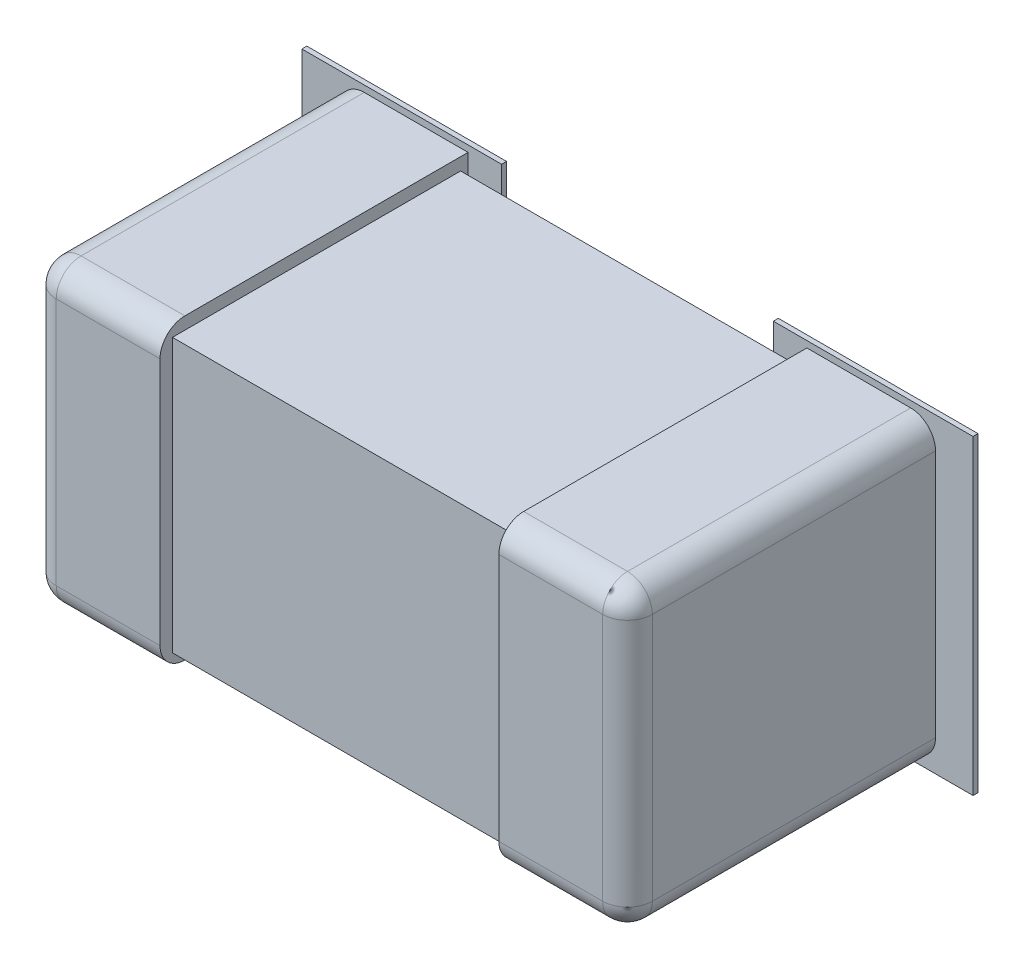
ISO-10303-21;
HEADER;
FILE_DESCRIPTION(('STEP AP214'),'2;1');
FILE_NAME('part.step','',(''),(''),'','','');
FILE_SCHEMA(('AUTOMOTIVE_DESIGN { 1 0 10303 214 1 1 1 1 }'));
ENDSEC;
DATA;
#1=APPLICATION_CONTEXT('core data for automotive mechanical design processes');
#2=APPLICATION_PROTOCOL_DEFINITION('international standard','automotive_design',2000,#1);
#3=PRODUCT_CONTEXT('',#1,'mechanical');
#4=PRODUCT('Part','Part','',(#3));
#5=PRODUCT_RELATED_PRODUCT_CATEGORY('part','',(#4));
#6=PRODUCT_DEFINITION_FORMATION('','',#4);
#7=PRODUCT_DEFINITION_CONTEXT('part definition',#1,'design');
#8=PRODUCT_DEFINITION('design','',#6,#7);
#9=PRODUCT_DEFINITION_SHAPE('','',#8);
#10=(LENGTH_UNIT() NAMED_UNIT(*) SI_UNIT(.MILLI.,.METRE.));
#11=(NAMED_UNIT(*) PLANE_ANGLE_UNIT() SI_UNIT($,.RADIAN.));
#12=(NAMED_UNIT(*) SI_UNIT($,.STERADIAN.) SOLID_ANGLE_UNIT());
#13=UNCERTAINTY_MEASURE_WITH_UNIT(LENGTH_MEASURE(1.E-05),#10,'distance_accuracy_value','');
#14=(GEOMETRIC_REPRESENTATION_CONTEXT(3) GLOBAL_UNCERTAINTY_ASSIGNED_CONTEXT((#13)) GLOBAL_UNIT_ASSIGNED_CONTEXT((#10,
#11,#12)) REPRESENTATION_CONTEXT('',''));
#15=CARTESIAN_POINT('',(0.,0.,0.));
#16=DIRECTION('',(0.,0.,1.));
#17=DIRECTION('',(1.,0.,0.));
#18=AXIS2_PLACEMENT_3D('',#15,#16,#17);
#19=CARTESIAN_POINT('',(0.,0.,0.0762));
#20=DIRECTION('',(0.,0.,1.));
#21=DIRECTION('',(1.,0.,0.));
#22=AXIS2_PLACEMENT_3D('',#19,#20,#21);
#23=PLANE('',#22);
#24=DIRECTION('',(1.,0.,0.));
#25=VECTOR('',#24,1.);
#26=CARTESIAN_POINT('',(0.138938,-0.159004,0.0762));
#27=LINE('',#26,#25);
#28=CARTESIAN_POINT('',(0.138938,-0.159004,0.0762));
#29=VERTEX_POINT('',#28);
#30=CARTESIAN_POINT('',(0.343154,-0.159004,0.0762));
#31=VERTEX_POINT('',#30);
#32=EDGE_CURVE('E331',#29,#31,#27,.T.);
#33=ORIENTED_EDGE('',*,*,#32,.F.);
#34=DIRECTION('',(0.,1.,0.));
#35=VECTOR('',#34,1.);
#36=CARTESIAN_POINT('',(0.138938,0.159004,0.0762));
#37=LINE('',#36,#35);
#38=CARTESIAN_POINT('',(0.138938,0.159004,0.0762));
#39=VERTEX_POINT('',#38);
#40=EDGE_CURVE('E336',#39,#29,#37,.F.);
#41=ORIENTED_EDGE('',*,*,#40,.F.);
#42=DIRECTION('',(1.,0.,0.));
#43=VECTOR('',#42,1.);
#44=CARTESIAN_POINT('',(0.343154,0.159004,0.0762));
#45=LINE('',#44,#43);
#46=CARTESIAN_POINT('',(0.343154,0.159004,0.0762));
#47=VERTEX_POINT('',#46);
#48=EDGE_CURVE('E320',#47,#39,#45,.F.);
#49=ORIENTED_EDGE('',*,*,#48,.F.);
#50=DIRECTION('',(0.,1.,0.));
#51=VECTOR('',#50,1.);
#52=CARTESIAN_POINT('',(0.343154,-0.159004,0.0762));
#53=LINE('',#52,#51);
#54=EDGE_CURVE('E96',#31,#47,#53,.T.);
#55=ORIENTED_EDGE('',*,*,#54,.F.);
#56=EDGE_LOOP('',(#33,#41,#49,#55));
#57=FACE_BOUND('',#56,.T.);
#58=ADVANCED_FACE('F17',(#57),#23,.F.);
#59=CARTESIAN_POINT('',(0.,0.,0.0762));
#60=DIRECTION('',(0.,0.,1.));
#61=DIRECTION('',(1.,0.,0.));
#62=AXIS2_PLACEMENT_3D('',#59,#60,#61);
#63=PLANE('',#62);
#64=DIRECTION('',(1.,0.,0.));
#65=VECTOR('',#64,1.);
#66=CARTESIAN_POINT('',(-0.138938,0.159004,0.0762));
#67=LINE('',#66,#65);
#68=CARTESIAN_POINT('',(-0.138938,0.159004,0.0762));
#69=VERTEX_POINT('',#68);
#70=CARTESIAN_POINT('',(-0.343154,0.159004,0.0762));
#71=VERTEX_POINT('',#70);
#72=EDGE_CURVE('E279',#69,#71,#67,.F.);
#73=ORIENTED_EDGE('',*,*,#72,.F.);
#74=DIRECTION('',(0.,1.,0.));
#75=VECTOR('',#74,1.);
#76=CARTESIAN_POINT('',(-0.138938,-0.159004,0.0762));
#77=LINE('',#76,#75);
#78=CARTESIAN_POINT('',(-0.138938,-0.159004,0.0762));
#79=VERTEX_POINT('',#78);
#80=EDGE_CURVE('E285',#79,#69,#77,.T.);
#81=ORIENTED_EDGE('',*,*,#80,.F.);
#82=DIRECTION('',(1.,0.,0.));
#83=VECTOR('',#82,1.);
#84=CARTESIAN_POINT('',(-0.343154,-0.159004,0.0762));
#85=LINE('',#84,#83);
#86=CARTESIAN_POINT('',(-0.343154,-0.159004,0.0762));
#87=VERTEX_POINT('',#86);
#88=EDGE_CURVE('E264',#87,#79,#85,.T.);
#89=ORIENTED_EDGE('',*,*,#88,.F.);
#90=DIRECTION('',(0.,1.,0.));
#91=VECTOR('',#90,1.);
#92=CARTESIAN_POINT('',(-0.343154,0.159004,0.0762));
#93=LINE('',#92,#91);
#94=EDGE_CURVE('E273',#71,#87,#93,.F.);
#95=ORIENTED_EDGE('',*,*,#94,.F.);
#96=EDGE_LOOP('',(#73,#81,#89,#95));
#97=FACE_BOUND('',#96,.T.);
#98=ADVANCED_FACE('F663',(#97),#63,.F.);
#99=CARTESIAN_POINT('',(0.138938,0.159004,0.0762));
#100=DIRECTION('',(-1.,0.,0.));
#101=DIRECTION('',(0.,0.,1.));
#102=AXIS2_PLACEMENT_3D('',#99,#100,#101);
#103=PLANE('',#102);
#104=DIRECTION('',(0.,0.,1.));
#105=VECTOR('',#104,1.);
#106=CARTESIAN_POINT('',(0.138938,0.159004,0.0762));
#107=LINE('',#106,#105);
#108=CARTESIAN_POINT('',(0.138938,0.159004,0.08128));
#109=VERTEX_POINT('',#108);
#110=EDGE_CURVE('E325',#39,#109,#107,.T.);
#111=ORIENTED_EDGE('',*,*,#110,.F.);
#112=ORIENTED_EDGE('',*,*,#40,.T.);
#113=DIRECTION('',(0.,0.,-1.));
#114=VECTOR('',#113,1.);
#115=CARTESIAN_POINT('',(0.138938,-0.159004,0.0762));
#116=LINE('',#115,#114);
#117=CARTESIAN_POINT('',(0.138938,-0.159004,0.08128));
#118=VERTEX_POINT('',#117);
#119=EDGE_CURVE('E333',#118,#29,#116,.T.);
#120=ORIENTED_EDGE('',*,*,#119,.F.);
#121=DIRECTION('',(0.,1.,0.));
#122=VECTOR('',#121,1.);
#123=CARTESIAN_POINT('',(0.138938,0.,0.08128));
#124=LINE('',#123,#122);
#125=EDGE_CURVE('E217',#109,#118,#124,.F.);
#126=ORIENTED_EDGE('',*,*,#125,.F.);
#127=EDGE_LOOP('',(#111,#112,#120,#126));
#128=FACE_BOUND('',#127,.T.);
#129=ADVANCED_FACE('F669',(#128),#103,.T.);
#130=CARTESIAN_POINT('',(0.138938,-0.159004,0.0762));
#131=DIRECTION('',(0.,-1.,0.));
#132=DIRECTION('',(0.,0.,-1.));
#133=AXIS2_PLACEMENT_3D('',#130,#131,#132);
#134=PLANE('',#133);
#135=ORIENTED_EDGE('',*,*,#119,.T.);
#136=ORIENTED_EDGE('',*,*,#32,.T.);
#137=DIRECTION('',(0.,0.,-1.));
#138=VECTOR('',#137,1.);
#139=CARTESIAN_POINT('',(0.343154,-0.159004,0.0762));
#140=LINE('',#139,#138);
#141=CARTESIAN_POINT('',(0.343154,-0.159004,0.08128));
#142=VERTEX_POINT('',#141);
#143=EDGE_CURVE('E329',#142,#31,#140,.T.);
#144=ORIENTED_EDGE('',*,*,#143,.F.);
#145=DIRECTION('',(1.,0.,0.));
#146=VECTOR('',#145,1.);
#147=CARTESIAN_POINT('',(0.,-0.159004,0.08128));
#148=LINE('',#147,#146);
#149=EDGE_CURVE('E214',#118,#142,#148,.T.);
#150=ORIENTED_EDGE('',*,*,#149,.F.);
#151=EDGE_LOOP('',(#135,#136,#144,#150));
#152=FACE_BOUND('',#151,.T.);
#153=ADVANCED_FACE('F714',(#152),#134,.T.);
#154=CARTESIAN_POINT('',(0.343154,-0.159004,0.0762));
#155=DIRECTION('',(1.,0.,0.));
#156=DIRECTION('',(0.,0.,-1.));
#157=AXIS2_PLACEMENT_3D('',#154,#155,#156);
#158=PLANE('',#157);
#159=ORIENTED_EDGE('',*,*,#143,.T.);
#160=ORIENTED_EDGE('',*,*,#54,.T.);
#161=DIRECTION('',(0.,0.,1.));
#162=VECTOR('',#161,1.);
#163=CARTESIAN_POINT('',(0.343154,0.159004,0.0762));
#164=LINE('',#163,#162);
#165=CARTESIAN_POINT('',(0.343154,0.159004,0.08128));
#166=VERTEX_POINT('',#165);
#167=EDGE_CURVE('E323',#166,#47,#164,.F.);
#168=ORIENTED_EDGE('',*,*,#167,.F.);
#169=DIRECTION('',(0.,1.,0.));
#170=VECTOR('',#169,1.);
#171=CARTESIAN_POINT('',(0.343154,0.,0.08128));
#172=LINE('',#171,#170);
#173=EDGE_CURVE('E211',#142,#166,#172,.T.);
#174=ORIENTED_EDGE('',*,*,#173,.F.);
#175=EDGE_LOOP('',(#159,#160,#168,#174));
#176=FACE_BOUND('',#175,.T.);
#177=ADVANCED_FACE('F721',(#176),#158,.T.);
#178=CARTESIAN_POINT('',(0.343154,0.159004,0.0762));
#179=DIRECTION('',(0.,1.,0.));
#180=DIRECTION('',(0.,0.,1.));
#181=AXIS2_PLACEMENT_3D('',#178,#179,#180);
#182=PLANE('',#181);
#183=ORIENTED_EDGE('',*,*,#167,.T.);
#184=ORIENTED_EDGE('',*,*,#48,.T.);
#185=ORIENTED_EDGE('',*,*,#110,.T.);
#186=DIRECTION('',(1.,0.,0.));
#187=VECTOR('',#186,1.);
#188=CARTESIAN_POINT('',(0.,0.159004,0.08128));
#189=LINE('',#188,#187);
#190=EDGE_CURVE('E208',#166,#109,#189,.F.);
#191=ORIENTED_EDGE('',*,*,#190,.F.);
#192=EDGE_LOOP('',(#183,#184,#185,#191));
#193=FACE_BOUND('',#192,.T.);
#194=ADVANCED_FACE('F729',(#193),#182,.T.);
#195=CARTESIAN_POINT('',(0.3048,-0.1524,0.0762));
#196=DIRECTION('',(1.,0.,0.));
#197=DIRECTION('',(0.,0.,-1.));
#198=AXIS2_PLACEMENT_3D('',#195,#196,#197);
#199=PLANE('',#198);
#200=DIRECTION('',(0.,0.,-1.));
#201=VECTOR('',#200,1.);
#202=CARTESIAN_POINT('',(0.3048,-0.127,0.813444144));
#203=LINE('',#202,#201);
#204=CARTESIAN_POINT('',(0.3048,-0.127,0.08128));
#205=VERTEX_POINT('',#204);
#206=CARTESIAN_POINT('',(0.3048,-0.127,0.37084));
#207=VERTEX_POINT('',#206);
#208=EDGE_CURVE('E316',#205,#207,#203,.F.);
#209=ORIENTED_EDGE('',*,*,#208,.F.);
#210=DIRECTION('',(0.,1.,0.));
#211=VECTOR('',#210,1.);
#212=CARTESIAN_POINT('',(0.3048,0.,0.08128));
#213=LINE('',#212,#211);
#214=CARTESIAN_POINT('',(0.3048,0.127,0.08128));
#215=VERTEX_POINT('',#214);
#216=EDGE_CURVE('E206',#215,#205,#213,.F.);
#217=ORIENTED_EDGE('',*,*,#216,.F.);
#218=DIRECTION('',(0.,0.,-1.));
#219=VECTOR('',#218,1.);
#220=CARTESIAN_POINT('',(0.3048,0.127,0.813444144));
#221=LINE('',#220,#219);
#222=CARTESIAN_POINT('',(0.3048,0.127,0.37084));
#223=VERTEX_POINT('',#222);
#224=EDGE_CURVE('E87',#223,#215,#221,.T.);
#225=ORIENTED_EDGE('',*,*,#224,.F.);
#226=DIRECTION('',(0.,1.,0.));
#227=VECTOR('',#226,1.);
#228=CARTESIAN_POINT('',(0.3048,-0.5735592288,0.37084));
#229=LINE('',#228,#227);
#230=EDGE_CURVE('E342',#207,#223,#229,.T.);
#231=ORIENTED_EDGE('',*,*,#230,.F.);
#232=EDGE_LOOP('',(#209,#217,#225,#231));
#233=FACE_BOUND('',#232,.T.);
#234=ADVANCED_FACE('F736',(#233),#199,.T.);
#235=CARTESIAN_POINT('',(0.2794,0.127,0.813444144));
#236=DIRECTION('',(0.,0.,-1.));
#237=DIRECTION('',(-1.,0.,0.));
#238=AXIS2_PLACEMENT_3D('',#235,#236,#237);
#239=CYLINDRICAL_SURFACE('',#238,0.0254);
#240=ORIENTED_EDGE('',*,*,#224,.T.);
#241=CARTESIAN_POINT('',(0.2794,0.127,0.08128));
#242=DIRECTION('',(0.,0.,-1.));
#243=DIRECTION('',(-1.,0.,0.));
#244=AXIS2_PLACEMENT_3D('',#241,#242,#243);
#245=CIRCLE('',#244,0.0254);
#246=CARTESIAN_POINT('',(0.2794,0.1524,0.08128));
#247=VERTEX_POINT('',#246);
#248=EDGE_CURVE('E186',#247,#215,#245,.T.);
#249=ORIENTED_EDGE('',*,*,#248,.F.);
#250=DIRECTION('',(0.,0.,1.));
#251=VECTOR('',#250,1.);
#252=CARTESIAN_POINT('',(0.2794,0.1524,0.0762));
#253=LINE('',#252,#251);
#254=CARTESIAN_POINT('',(0.2794,0.1524,0.37084));
#255=VERTEX_POINT('',#254);
#256=EDGE_CURVE('E163',#255,#247,#253,.F.);
#257=ORIENTED_EDGE('',*,*,#256,.F.);
#258=CARTESIAN_POINT('',(0.2794,0.127,0.37084));
#259=DIRECTION('',(0.,0.,-1.));
#260=DIRECTION('',(-1.,0.,0.));
#261=AXIS2_PLACEMENT_3D('',#258,#259,#260);
#262=CIRCLE('',#261,0.0254);
#263=EDGE_CURVE('E20',#223,#255,#262,.F.);
#264=ORIENTED_EDGE('',*,*,#263,.F.);
#265=EDGE_LOOP('',(#240,#249,#257,#264));
#266=FACE_BOUND('',#265,.T.);
#267=ADVANCED_FACE('F184',(#266),#239,.T.);
#268=CARTESIAN_POINT('',(0.2794,0.127,0.37084));
#269=DIRECTION('',(0.,0.707106781186548,0.707106781186548));
#270=DIRECTION('',(1.,0.,0.));
#271=AXIS2_PLACEMENT_3D('',#268,#269,#270);
#272=SPHERICAL_SURFACE('',#271,0.0254);
#273=CARTESIAN_POINT('',(0.2794,0.127,0.37084));
#274=DIRECTION('',(-1.,0.,0.));
#275=DIRECTION('',(0.,0.,1.));
#276=AXIS2_PLACEMENT_3D('',#273,#274,#275);
#277=CIRCLE('',#276,0.0254);
#278=CARTESIAN_POINT('',(0.2794,0.127,0.39624));
#279=VERTEX_POINT('',#278);
#280=CARTESIAN_POINT('',(0.2794,0.144960512242138,0.388800512242138));
#281=VERTEX_POINT('',#280);
#282=EDGE_CURVE('E182',#279,#281,#277,.T.);
#283=ORIENTED_EDGE('',*,*,#282,.F.);
#284=CARTESIAN_POINT('',(0.2794,0.127,0.37084));
#285=DIRECTION('',(0.,1.,0.));
#286=DIRECTION('',(0.,0.,1.));
#287=AXIS2_PLACEMENT_3D('',#284,#285,#286);
#288=CIRCLE('',#287,0.0254);
#289=EDGE_CURVE('E173',#223,#279,#288,.F.);
#290=ORIENTED_EDGE('',*,*,#289,.F.);
#291=ORIENTED_EDGE('',*,*,#263,.T.);
#292=CARTESIAN_POINT('',(0.2794,0.127,0.37084));
#293=DIRECTION('',(-1.,0.,0.));
#294=DIRECTION('',(0.,0.,1.));
#295=AXIS2_PLACEMENT_3D('',#292,#293,#294);
#296=CIRCLE('',#295,0.0254);
#297=EDGE_CURVE('E172',#281,#255,#296,.T.);
#298=ORIENTED_EDGE('',*,*,#297,.F.);
#299=EDGE_LOOP('',(#283,#290,#291,#298));
#300=FACE_BOUND('',#299,.T.);
#301=ADVANCED_FACE('F171',(#300),#272,.T.);
#302=CARTESIAN_POINT('',(0.2794,-0.5735592288,0.37084));
#303=DIRECTION('',(0.,1.,0.));
#304=DIRECTION('',(0.,0.,1.));
#305=AXIS2_PLACEMENT_3D('',#302,#303,#304);
#306=CYLINDRICAL_SURFACE('',#305,0.0254);
#307=CARTESIAN_POINT('',(0.2794,-0.127,0.37084));
#308=DIRECTION('',(0.,1.,0.));
#309=DIRECTION('',(0.,0.,1.));
#310=AXIS2_PLACEMENT_3D('',#307,#308,#309);
#311=CIRCLE('',#310,0.0254);
#312=CARTESIAN_POINT('',(0.297360512242138,-0.127,0.388800512242138));
#313=VERTEX_POINT('',#312);
#314=EDGE_CURVE('E344',#207,#313,#311,.F.);
#315=ORIENTED_EDGE('',*,*,#314,.F.);
#316=ORIENTED_EDGE('',*,*,#230,.T.);
#317=ORIENTED_EDGE('',*,*,#289,.T.);
#318=DIRECTION('',(0.,1.,0.));
#319=VECTOR('',#318,1.);
#320=CARTESIAN_POINT('',(0.2794,0.,0.39624));
#321=LINE('',#320,#319);
#322=CARTESIAN_POINT('',(0.2794,-0.127,0.39624));
#323=VERTEX_POINT('',#322);
#324=EDGE_CURVE('E195',#323,#279,#321,.T.);
#325=ORIENTED_EDGE('',*,*,#324,.F.);
#326=CARTESIAN_POINT('',(0.2794,-0.127,0.37084));
#327=DIRECTION('',(0.,-1.,0.));
#328=DIRECTION('',(0.707106781186548,0.,0.707106781186548));
#329=AXIS2_PLACEMENT_3D('',#326,#327,#328);
#330=CIRCLE('',#329,0.0254);
#331=EDGE_CURVE('E296',#313,#323,#330,.T.);
#332=ORIENTED_EDGE('',*,*,#331,.F.);
#333=EDGE_LOOP('',(#315,#316,#317,#325,#332));
#334=FACE_BOUND('',#333,.T.);
#335=ADVANCED_FACE('F304',(#334),#306,.T.);
#336=CARTESIAN_POINT('',(0.2794,-0.127,0.37084));
#337=DIRECTION('',(0.707106781186548,0.,0.707106781186548));
#338=DIRECTION('',(0.,-1.,0.));
#339=AXIS2_PLACEMENT_3D('',#336,#337,#338);
#340=SPHERICAL_SURFACE('',#339,0.0254);
#341=ORIENTED_EDGE('',*,*,#331,.T.);
#342=CARTESIAN_POINT('',(0.2794,-0.127,0.37084));
#343=DIRECTION('',(1.,0.,0.));
#344=DIRECTION('',(0.,0.,-1.));
#345=AXIS2_PLACEMENT_3D('',#342,#343,#344);
#346=CIRCLE('',#345,0.0254);
#347=CARTESIAN_POINT('',(0.2794,-0.1524,0.37084));
#348=VERTEX_POINT('',#347);
#349=EDGE_CURVE('E374',#348,#323,#346,.F.);
#350=ORIENTED_EDGE('',*,*,#349,.F.);
#351=CARTESIAN_POINT('',(0.2794,-0.127,0.37084));
#352=DIRECTION('',(0.,0.,-1.));
#353=DIRECTION('',(-1.,0.,0.));
#354=AXIS2_PLACEMENT_3D('',#351,#352,#353);
#355=CIRCLE('',#354,0.0254);
#356=EDGE_CURVE('E288',#207,#348,#355,.T.);
#357=ORIENTED_EDGE('',*,*,#356,.F.);
#358=ORIENTED_EDGE('',*,*,#314,.T.);
#359=EDGE_LOOP('',(#341,#350,#357,#358));
#360=FACE_BOUND('',#359,.T.);
#361=ADVANCED_FACE('F299',(#360),#340,.T.);
#362=CARTESIAN_POINT('',(0.2794,-0.127,0.813444144));
#363=DIRECTION('',(0.,0.,-1.));
#364=DIRECTION('',(-1.,0.,0.));
#365=AXIS2_PLACEMENT_3D('',#362,#363,#364);
#366=CYLINDRICAL_SURFACE('',#365,0.0254);
#367=DIRECTION('',(0.,0.,-1.));
#368=VECTOR('',#367,1.);
#369=CARTESIAN_POINT('',(0.2794,-0.1524,0.0762));
#370=LINE('',#369,#368);
#371=CARTESIAN_POINT('',(0.2794,-0.1524,0.08128));
#372=VERTEX_POINT('',#371);
#373=EDGE_CURVE('E289',#372,#348,#370,.F.);
#374=ORIENTED_EDGE('',*,*,#373,.F.);
#375=CARTESIAN_POINT('',(0.2794,-0.127,0.08128));
#376=DIRECTION('',(0.,0.,-1.));
#377=DIRECTION('',(-1.,0.,0.));
#378=AXIS2_PLACEMENT_3D('',#375,#376,#377);
#379=CIRCLE('',#378,0.0254);
#380=EDGE_CURVE('E189',#205,#372,#379,.T.);
#381=ORIENTED_EDGE('',*,*,#380,.F.);
#382=ORIENTED_EDGE('',*,*,#208,.T.);
#383=ORIENTED_EDGE('',*,*,#356,.T.);
#384=EDGE_LOOP('',(#374,#381,#382,#383));
#385=FACE_BOUND('',#384,.T.);
#386=ADVANCED_FACE('F303',(#385),#366,.T.);
#387=CARTESIAN_POINT('',(-0.138938,-0.159004,0.0762));
#388=DIRECTION('',(1.,0.,0.));
#389=DIRECTION('',(0.,0.,-1.));
#390=AXIS2_PLACEMENT_3D('',#387,#388,#389);
#391=PLANE('',#390);
#392=DIRECTION('',(0.,0.,-1.));
#393=VECTOR('',#392,1.);
#394=CARTESIAN_POINT('',(-0.138938,-0.159004,0.0762));
#395=LINE('',#394,#393);
#396=CARTESIAN_POINT('',(-0.138938,-0.159004,0.08128));
#397=VERTEX_POINT('',#396);
#398=EDGE_CURVE('E270',#79,#397,#395,.F.);
#399=ORIENTED_EDGE('',*,*,#398,.F.);
#400=ORIENTED_EDGE('',*,*,#80,.T.);
#401=DIRECTION('',(0.,0.,1.));
#402=VECTOR('',#401,1.);
#403=CARTESIAN_POINT('',(-0.138938,0.159004,0.0762));
#404=LINE('',#403,#402);
#405=CARTESIAN_POINT('',(-0.138938,0.159004,0.08128));
#406=VERTEX_POINT('',#405);
#407=EDGE_CURVE('E282',#406,#69,#404,.F.);
#408=ORIENTED_EDGE('',*,*,#407,.F.);
#409=DIRECTION('',(0.,1.,0.));
#410=VECTOR('',#409,1.);
#411=CARTESIAN_POINT('',(-0.138938,0.,0.08128));
#412=LINE('',#411,#410);
#413=EDGE_CURVE('E439',#397,#406,#412,.T.);
#414=ORIENTED_EDGE('',*,*,#413,.F.);
#415=EDGE_LOOP('',(#399,#400,#408,#414));
#416=FACE_BOUND('',#415,.T.);
#417=ADVANCED_FACE('F766',(#416),#391,.T.);
#418=CARTESIAN_POINT('',(-0.138938,0.159004,0.0762));
#419=DIRECTION('',(0.,1.,0.));
#420=DIRECTION('',(0.,0.,1.));
#421=AXIS2_PLACEMENT_3D('',#418,#419,#420);
#422=PLANE('',#421);
#423=ORIENTED_EDGE('',*,*,#407,.T.);
#424=ORIENTED_EDGE('',*,*,#72,.T.);
#425=DIRECTION('',(0.,0.,1.));
#426=VECTOR('',#425,1.);
#427=CARTESIAN_POINT('',(-0.343154,0.159004,0.0762));
#428=LINE('',#427,#426);
#429=CARTESIAN_POINT('',(-0.343154,0.159004,0.08128));
#430=VERTEX_POINT('',#429);
#431=EDGE_CURVE('E276',#430,#71,#428,.F.);
#432=ORIENTED_EDGE('',*,*,#431,.F.);
#433=DIRECTION('',(1.,0.,0.));
#434=VECTOR('',#433,1.);
#435=CARTESIAN_POINT('',(0.,0.159004,0.08128));
#436=LINE('',#435,#434);
#437=EDGE_CURVE('E436',#406,#430,#436,.F.);
#438=ORIENTED_EDGE('',*,*,#437,.F.);
#439=EDGE_LOOP('',(#423,#424,#432,#438));
#440=FACE_BOUND('',#439,.T.);
#441=ADVANCED_FACE('F772',(#440),#422,.T.);
#442=CARTESIAN_POINT('',(-0.343154,0.159004,0.0762));
#443=DIRECTION('',(-1.,0.,0.));
#444=DIRECTION('',(0.,0.,1.));
#445=AXIS2_PLACEMENT_3D('',#442,#443,#444);
#446=PLANE('',#445);
#447=ORIENTED_EDGE('',*,*,#431,.T.);
#448=ORIENTED_EDGE('',*,*,#94,.T.);
#449=DIRECTION('',(0.,0.,-1.));
#450=VECTOR('',#449,1.);
#451=CARTESIAN_POINT('',(-0.343154,-0.159004,0.0762));
#452=LINE('',#451,#450);
#453=CARTESIAN_POINT('',(-0.343154,-0.159004,0.08128));
#454=VERTEX_POINT('',#453);
#455=EDGE_CURVE('E267',#454,#87,#452,.T.);
#456=ORIENTED_EDGE('',*,*,#455,.F.);
#457=DIRECTION('',(0.,1.,0.));
#458=VECTOR('',#457,1.);
#459=CARTESIAN_POINT('',(-0.343154,0.,0.08128));
#460=LINE('',#459,#458);
#461=EDGE_CURVE('E433',#430,#454,#460,.F.);
#462=ORIENTED_EDGE('',*,*,#461,.F.);
#463=EDGE_LOOP('',(#447,#448,#456,#462));
#464=FACE_BOUND('',#463,.T.);
#465=ADVANCED_FACE('F779',(#464),#446,.T.);
#466=CARTESIAN_POINT('',(-0.343154,-0.159004,0.0762));
#467=DIRECTION('',(0.,-1.,0.));
#468=DIRECTION('',(0.,0.,-1.));
#469=AXIS2_PLACEMENT_3D('',#466,#467,#468);
#470=PLANE('',#469);
#471=ORIENTED_EDGE('',*,*,#455,.T.);
#472=ORIENTED_EDGE('',*,*,#88,.T.);
#473=ORIENTED_EDGE('',*,*,#398,.T.);
#474=DIRECTION('',(1.,0.,0.));
#475=VECTOR('',#474,1.);
#476=CARTESIAN_POINT('',(0.,-0.159004,0.08128));
#477=LINE('',#476,#475);
#478=EDGE_CURVE('E373',#454,#397,#477,.T.);
#479=ORIENTED_EDGE('',*,*,#478,.F.);
#480=EDGE_LOOP('',(#471,#472,#473,#479));
#481=FACE_BOUND('',#480,.T.);
#482=ADVANCED_FACE('F787',(#481),#470,.T.);
#483=CARTESIAN_POINT('',(-0.3048,0.1524,0.0762));
#484=DIRECTION('',(-1.,0.,0.));
#485=DIRECTION('',(0.,0.,1.));
#486=AXIS2_PLACEMENT_3D('',#483,#484,#485);
#487=PLANE('',#486);
#488=DIRECTION('',(0.,0.,-1.));
#489=VECTOR('',#488,1.);
#490=CARTESIAN_POINT('',(-0.3048,0.127,0.813444144));
#491=LINE('',#490,#489);
#492=CARTESIAN_POINT('',(-0.3048,0.127,0.08128));
#493=VERTEX_POINT('',#492);
#494=CARTESIAN_POINT('',(-0.3048,0.127,0.37084));
#495=VERTEX_POINT('',#494);
#496=EDGE_CURVE('E227',#493,#495,#491,.F.);
#497=ORIENTED_EDGE('',*,*,#496,.F.);
#498=DIRECTION('',(0.,1.,0.));
#499=VECTOR('',#498,1.);
#500=CARTESIAN_POINT('',(-0.3048,0.,0.08128));
#501=LINE('',#500,#499);
#502=CARTESIAN_POINT('',(-0.3048,-0.127,0.08128));
#503=VERTEX_POINT('',#502);
#504=EDGE_CURVE('E369',#503,#493,#501,.T.);
#505=ORIENTED_EDGE('',*,*,#504,.F.);
#506=DIRECTION('',(0.,0.,-1.));
#507=VECTOR('',#506,1.);
#508=CARTESIAN_POINT('',(-0.3048,-0.127,0.813444144));
#509=LINE('',#508,#507);
#510=CARTESIAN_POINT('',(-0.3048,-0.127,0.37084));
#511=VERTEX_POINT('',#510);
#512=EDGE_CURVE('E261',#511,#503,#509,.T.);
#513=ORIENTED_EDGE('',*,*,#512,.F.);
#514=DIRECTION('',(0.,-1.,0.));
#515=VECTOR('',#514,1.);
#516=CARTESIAN_POINT('',(-0.3048,0.5735592288,0.37084));
#517=LINE('',#516,#515);
#518=EDGE_CURVE('E338',#495,#511,#517,.T.);
#519=ORIENTED_EDGE('',*,*,#518,.F.);
#520=EDGE_LOOP('',(#497,#505,#513,#519));
#521=FACE_BOUND('',#520,.T.);
#522=ADVANCED_FACE('F795',(#521),#487,.T.);
#523=CARTESIAN_POINT('',(-0.2794,-0.127,0.813444144));
#524=DIRECTION('',(0.,0.,-1.));
#525=DIRECTION('',(-1.,0.,0.));
#526=AXIS2_PLACEMENT_3D('',#523,#524,#525);
#527=CYLINDRICAL_SURFACE('',#526,0.0254);
#528=ORIENTED_EDGE('',*,*,#512,.T.);
#529=CARTESIAN_POINT('',(-0.2794,-0.127,0.08128));
#530=DIRECTION('',(0.,0.,-1.));
#531=DIRECTION('',(-1.,0.,0.));
#532=AXIS2_PLACEMENT_3D('',#529,#530,#531);
#533=CIRCLE('',#532,0.0254);
#534=CARTESIAN_POINT('',(-0.2794,-0.1524,0.08128));
#535=VERTEX_POINT('',#534);
#536=EDGE_CURVE('E370',#535,#503,#533,.T.);
#537=ORIENTED_EDGE('',*,*,#536,.F.);
#538=DIRECTION('',(0.,0.,-1.));
#539=VECTOR('',#538,1.);
#540=CARTESIAN_POINT('',(-0.2794,-0.1524,0.0762));
#541=LINE('',#540,#539);
#542=CARTESIAN_POINT('',(-0.2794,-0.1524,0.37084));
#543=VERTEX_POINT('',#542);
#544=EDGE_CURVE('E258',#543,#535,#541,.T.);
#545=ORIENTED_EDGE('',*,*,#544,.F.);
#546=CARTESIAN_POINT('',(-0.2794,-0.127,0.37084));
#547=DIRECTION('',(0.,0.,-1.));
#548=DIRECTION('',(-1.,0.,0.));
#549=AXIS2_PLACEMENT_3D('',#546,#547,#548);
#550=CIRCLE('',#549,0.0254);
#551=EDGE_CURVE('E263',#511,#543,#550,.F.);
#552=ORIENTED_EDGE('',*,*,#551,.F.);
#553=EDGE_LOOP('',(#528,#537,#545,#552));
#554=FACE_BOUND('',#553,.T.);
#555=ADVANCED_FACE('F253',(#554),#527,.T.);
#556=CARTESIAN_POINT('',(-0.2794,-0.127,0.37084));
#557=DIRECTION('',(0.,-0.707106781186548,0.707106781186548));
#558=DIRECTION('',(-1.,0.,0.));
#559=AXIS2_PLACEMENT_3D('',#556,#557,#558);
#560=SPHERICAL_SURFACE('',#559,0.0254);
#561=CARTESIAN_POINT('',(-0.2794,-0.127,0.37084));
#562=DIRECTION('',(1.,0.,0.));
#563=DIRECTION('',(0.,0.,-1.));
#564=AXIS2_PLACEMENT_3D('',#561,#562,#563);
#565=CIRCLE('',#564,0.0254);
#566=CARTESIAN_POINT('',(-0.2794,-0.127,0.39624));
#567=VERTEX_POINT('',#566);
#568=CARTESIAN_POINT('',(-0.2794,-0.144960512242138,0.388800512242138));
#569=VERTEX_POINT('',#568);
#570=EDGE_CURVE('E235',#567,#569,#565,.T.);
#571=ORIENTED_EDGE('',*,*,#570,.F.);
#572=CARTESIAN_POINT('',(-0.2794,-0.127,0.37084));
#573=DIRECTION('',(0.,-1.,0.));
#574=DIRECTION('',(0.,0.,-1.));
#575=AXIS2_PLACEMENT_3D('',#572,#573,#574);
#576=CIRCLE('',#575,0.0254);
#577=EDGE_CURVE('E341',#511,#567,#576,.F.);
#578=ORIENTED_EDGE('',*,*,#577,.F.);
#579=ORIENTED_EDGE('',*,*,#551,.T.);
#580=CARTESIAN_POINT('',(-0.2794,-0.127,0.37084));
#581=DIRECTION('',(1.,0.,0.));
#582=DIRECTION('',(0.,0.,-1.));
#583=AXIS2_PLACEMENT_3D('',#580,#581,#582);
#584=CIRCLE('',#583,0.0254);
#585=EDGE_CURVE('E364',#569,#543,#584,.T.);
#586=ORIENTED_EDGE('',*,*,#585,.F.);
#587=EDGE_LOOP('',(#571,#578,#579,#586));
#588=FACE_BOUND('',#587,.T.);
#589=ADVANCED_FACE('F248',(#588),#560,.T.);
#590=CARTESIAN_POINT('',(-0.2794,0.5735592288,0.37084));
#591=DIRECTION('',(0.,-1.,0.));
#592=DIRECTION('',(0.,0.,-1.));
#593=AXIS2_PLACEMENT_3D('',#590,#591,#592);
#594=CYLINDRICAL_SURFACE('',#593,0.0254);
#595=CARTESIAN_POINT('',(-0.2794,0.127,0.37084));
#596=DIRECTION('',(0.,-1.,0.));
#597=DIRECTION('',(0.,0.,-1.));
#598=AXIS2_PLACEMENT_3D('',#595,#596,#597);
#599=CIRCLE('',#598,0.0254);
#600=CARTESIAN_POINT('',(-0.2794,0.127,0.39624));
#601=VERTEX_POINT('',#600);
#602=EDGE_CURVE('E260',#495,#601,#599,.F.);
#603=ORIENTED_EDGE('',*,*,#602,.F.);
#604=ORIENTED_EDGE('',*,*,#518,.T.);
#605=ORIENTED_EDGE('',*,*,#577,.T.);
#606=DIRECTION('',(0.,1.,0.));
#607=VECTOR('',#606,1.);
#608=CARTESIAN_POINT('',(-0.2794,0.,0.39624));
#609=LINE('',#608,#607);
#610=EDGE_CURVE('E228',#601,#567,#609,.F.);
#611=ORIENTED_EDGE('',*,*,#610,.F.);
#612=EDGE_LOOP('',(#603,#604,#605,#611));
#613=FACE_BOUND('',#612,.T.);
#614=ADVANCED_FACE('F243',(#613),#594,.T.);
#615=CARTESIAN_POINT('',(-0.2794,0.127,0.37084));
#616=DIRECTION('',(-0.707106781186548,0.707106781186548,0.));
#617=DIRECTION('',(0.,0.,1.));
#618=AXIS2_PLACEMENT_3D('',#615,#616,#617);
#619=SPHERICAL_SURFACE('',#618,0.0254);
#620=ORIENTED_EDGE('',*,*,#602,.T.);
#621=CARTESIAN_POINT('',(-0.2794,0.127,0.37084));
#622=DIRECTION('',(-1.,0.,0.));
#623=DIRECTION('',(0.,0.,1.));
#624=AXIS2_PLACEMENT_3D('',#621,#622,#623);
#625=CIRCLE('',#624,0.0254);
#626=CARTESIAN_POINT('',(-0.2794,0.1524,0.37084));
#627=VERTEX_POINT('',#626);
#628=EDGE_CURVE('E361',#627,#601,#625,.F.);
#629=ORIENTED_EDGE('',*,*,#628,.F.);
#630=CARTESIAN_POINT('',(-0.2794,0.127,0.37084));
#631=DIRECTION('',(0.,0.,-1.));
#632=DIRECTION('',(-1.,0.,0.));
#633=AXIS2_PLACEMENT_3D('',#630,#631,#632);
#634=CIRCLE('',#633,0.0254);
#635=CARTESIAN_POINT('',(-0.297360512242138,0.144960512242138,0.37084));
#636=VERTEX_POINT('',#635);
#637=EDGE_CURVE('E220',#636,#627,#634,.T.);
#638=ORIENTED_EDGE('',*,*,#637,.F.);
#639=CARTESIAN_POINT('',(-0.2794,0.127,0.37084));
#640=DIRECTION('',(0.,0.,-1.));
#641=DIRECTION('',(-1.,0.,0.));
#642=AXIS2_PLACEMENT_3D('',#639,#640,#641);
#643=CIRCLE('',#642,0.0254);
#644=EDGE_CURVE('E35',#495,#636,#643,.T.);
#645=ORIENTED_EDGE('',*,*,#644,.F.);
#646=EDGE_LOOP('',(#620,#629,#638,#645));
#647=FACE_BOUND('',#646,.T.);
#648=ADVANCED_FACE('F238',(#647),#619,.T.);
#649=CARTESIAN_POINT('',(-0.2794,0.127,0.813444144));
#650=DIRECTION('',(0.,0.,-1.));
#651=DIRECTION('',(-1.,0.,0.));
#652=AXIS2_PLACEMENT_3D('',#649,#650,#651);
#653=CYLINDRICAL_SURFACE('',#652,0.0254);
#654=DIRECTION('',(0.,0.,1.));
#655=VECTOR('',#654,1.);
#656=CARTESIAN_POINT('',(-0.2794,0.1524,0.0762));
#657=LINE('',#656,#655);
#658=CARTESIAN_POINT('',(-0.2794,0.1524,0.08128));
#659=VERTEX_POINT('',#658);
#660=EDGE_CURVE('E221',#659,#627,#657,.T.);
#661=ORIENTED_EDGE('',*,*,#660,.F.);
#662=CARTESIAN_POINT('',(-0.2794,0.127,0.08128));
#663=DIRECTION('',(0.,0.,-1.));
#664=DIRECTION('',(-1.,0.,0.));
#665=AXIS2_PLACEMENT_3D('',#662,#663,#664);
#666=CIRCLE('',#665,0.0254);
#667=EDGE_CURVE('E367',#493,#659,#666,.T.);
#668=ORIENTED_EDGE('',*,*,#667,.F.);
#669=ORIENTED_EDGE('',*,*,#496,.T.);
#670=ORIENTED_EDGE('',*,*,#644,.T.);
#671=ORIENTED_EDGE('',*,*,#637,.T.);
#672=EDGE_LOOP('',(#661,#668,#669,#670,#671));
#673=FACE_BOUND('',#672,.T.);
#674=ADVANCED_FACE('F242',(#673),#653,.T.);
#675=CARTESIAN_POINT('',(0.,0.,0.08128));
#676=DIRECTION('',(0.,0.,1.));
#677=DIRECTION('',(1.,0.,0.));
#678=AXIS2_PLACEMENT_3D('',#675,#676,#677);
#679=PLANE('',#678);
#680=DIRECTION('',(0.,1.,0.));
#681=VECTOR('',#680,1.);
#682=CARTESIAN_POINT('',(0.173228,-0.1524,0.08128));
#683=LINE('',#682,#681);
#684=CARTESIAN_POINT('',(0.173228,-0.1524,0.08128));
#685=VERTEX_POINT('',#684);
#686=CARTESIAN_POINT('',(0.173228,0.1524,0.08128));
#687=VERTEX_POINT('',#686);
#688=EDGE_CURVE('E404',#685,#687,#683,.T.);
#689=ORIENTED_EDGE('',*,*,#688,.T.);
#690=DIRECTION('',(1.,0.,0.));
#691=VECTOR('',#690,1.);
#692=CARTESIAN_POINT('',(0.3048,0.1524,0.08128));
#693=LINE('',#692,#691);
#694=EDGE_CURVE('E188',#247,#687,#693,.F.);
#695=ORIENTED_EDGE('',*,*,#694,.F.);
#696=ORIENTED_EDGE('',*,*,#248,.T.);
#697=ORIENTED_EDGE('',*,*,#216,.T.);
#698=ORIENTED_EDGE('',*,*,#380,.T.);
#699=DIRECTION('',(1.,0.,0.));
#700=VECTOR('',#699,1.);
#701=CARTESIAN_POINT('',(-0.3048,-0.1524,0.08128));
#702=LINE('',#701,#700);
#703=EDGE_CURVE('E442',#685,#372,#702,.T.);
#704=ORIENTED_EDGE('',*,*,#703,.F.);
#705=EDGE_LOOP('',(#689,#695,#696,#697,#698,#704));
#706=FACE_BOUND('',#705,.T.);
#707=ORIENTED_EDGE('',*,*,#173,.T.);
#708=ORIENTED_EDGE('',*,*,#190,.T.);
#709=ORIENTED_EDGE('',*,*,#125,.T.);
#710=ORIENTED_EDGE('',*,*,#149,.T.);
#711=EDGE_LOOP('',(#707,#708,#709,#710));
#712=FACE_BOUND('',#711,.T.);
#713=ADVANCED_FACE('F464',(#706,#712),#679,.T.);
#714=CARTESIAN_POINT('',(0.3048,0.1524,0.0762));
#715=DIRECTION('',(0.,1.,0.));
#716=DIRECTION('',(0.,0.,1.));
#717=AXIS2_PLACEMENT_3D('',#714,#715,#716);
#718=PLANE('',#717);
#719=ORIENTED_EDGE('',*,*,#256,.T.);
#720=ORIENTED_EDGE('',*,*,#694,.T.);
#721=DIRECTION('',(0.,0.,-1.));
#722=VECTOR('',#721,1.);
#723=CARTESIAN_POINT('',(0.173228,0.1524,0.0889));
#724=LINE('',#723,#722);
#725=CARTESIAN_POINT('',(0.173228,0.1524,0.37084));
#726=VERTEX_POINT('',#725);
#727=EDGE_CURVE('E194',#687,#726,#724,.F.);
#728=ORIENTED_EDGE('',*,*,#727,.T.);
#729=DIRECTION('',(-1.,0.,0.));
#730=VECTOR('',#729,1.);
#731=CARTESIAN_POINT('',(1.2378251088,0.1524,0.37084));
#732=LINE('',#731,#730);
#733=EDGE_CURVE('E179',#255,#726,#732,.T.);
#734=ORIENTED_EDGE('',*,*,#733,.F.);
#735=EDGE_LOOP('',(#719,#720,#728,#734));
#736=FACE_BOUND('',#735,.T.);
#737=ADVANCED_FACE('F192',(#736),#718,.T.);
#738=CARTESIAN_POINT('',(1.2378251088,0.127,0.37084));
#739=DIRECTION('',(-1.,0.,0.));
#740=DIRECTION('',(0.,0.,1.));
#741=AXIS2_PLACEMENT_3D('',#738,#739,#740);
#742=CYLINDRICAL_SURFACE('',#741,0.0254);
#743=ORIENTED_EDGE('',*,*,#733,.T.);
#744=CARTESIAN_POINT('',(0.173228,0.127,0.37084));
#745=DIRECTION('',(-1.,0.,0.));
#746=DIRECTION('',(0.,0.,1.));
#747=AXIS2_PLACEMENT_3D('',#744,#745,#746);
#748=CIRCLE('',#747,0.0254);
#749=CARTESIAN_POINT('',(0.173228,0.127,0.39624));
#750=VERTEX_POINT('',#749);
#751=EDGE_CURVE('E359',#726,#750,#748,.F.);
#752=ORIENTED_EDGE('',*,*,#751,.T.);
#753=DIRECTION('',(1.,0.,0.));
#754=VECTOR('',#753,1.);
#755=CARTESIAN_POINT('',(0.,0.127,0.39624));
#756=LINE('',#755,#754);
#757=EDGE_CURVE('E198',#279,#750,#756,.F.);
#758=ORIENTED_EDGE('',*,*,#757,.F.);
#759=ORIENTED_EDGE('',*,*,#282,.T.);
#760=ORIENTED_EDGE('',*,*,#297,.T.);
#761=EDGE_LOOP('',(#743,#752,#758,#759,#760));
#762=FACE_BOUND('',#761,.T.);
#763=ADVANCED_FACE('F177',(#762),#742,.T.);
#764=CARTESIAN_POINT('',(0.,0.,0.39624));
#765=DIRECTION('',(0.,0.,1.));
#766=DIRECTION('',(1.,0.,0.));
#767=AXIS2_PLACEMENT_3D('',#764,#765,#766);
#768=PLANE('',#767);
#769=ORIENTED_EDGE('',*,*,#324,.T.);
#770=ORIENTED_EDGE('',*,*,#757,.T.);
#771=DIRECTION('',(0.,1.,0.));
#772=VECTOR('',#771,1.);
#773=CARTESIAN_POINT('',(0.173228,-0.1524,0.39624));
#774=LINE('',#773,#772);
#775=CARTESIAN_POINT('',(0.173228,-0.127,0.39624));
#776=VERTEX_POINT('',#775);
#777=EDGE_CURVE('E358',#750,#776,#774,.F.);
#778=ORIENTED_EDGE('',*,*,#777,.T.);
#779=DIRECTION('',(1.,0.,0.));
#780=VECTOR('',#779,1.);
#781=CARTESIAN_POINT('',(-1.2378251088,-0.127,0.39624));
#782=LINE('',#781,#780);
#783=EDGE_CURVE('E292',#323,#776,#782,.F.);
#784=ORIENTED_EDGE('',*,*,#783,.F.);
#785=EDGE_LOOP('',(#769,#770,#778,#784));
#786=FACE_BOUND('',#785,.T.);
#787=ADVANCED_FACE('F389',(#786),#768,.T.);
#788=CARTESIAN_POINT('',(-1.2378251088,-0.127,0.37084));
#789=DIRECTION('',(1.,0.,0.));
#790=DIRECTION('',(0.,0.,-1.));
#791=AXIS2_PLACEMENT_3D('',#788,#789,#790);
#792=CYLINDRICAL_SURFACE('',#791,0.0254);
#793=ORIENTED_EDGE('',*,*,#783,.T.);
#794=CARTESIAN_POINT('',(0.173228,-0.127,0.37084));
#795=DIRECTION('',(1.,0.,0.));
#796=DIRECTION('',(0.,0.,-1.));
#797=AXIS2_PLACEMENT_3D('',#794,#795,#796);
#798=CIRCLE('',#797,0.0254);
#799=CARTESIAN_POINT('',(0.173228,-0.1524,0.37084));
#800=VERTEX_POINT('',#799);
#801=EDGE_CURVE('E354',#776,#800,#798,.T.);
#802=ORIENTED_EDGE('',*,*,#801,.T.);
#803=DIRECTION('',(1.,0.,0.));
#804=VECTOR('',#803,1.);
#805=CARTESIAN_POINT('',(-0.3048,-0.1524,0.37084));
#806=LINE('',#805,#804);
#807=EDGE_CURVE('E291',#348,#800,#806,.F.);
#808=ORIENTED_EDGE('',*,*,#807,.F.);
#809=ORIENTED_EDGE('',*,*,#349,.T.);
#810=EDGE_LOOP('',(#793,#802,#808,#809));
#811=FACE_BOUND('',#810,.T.);
#812=ADVANCED_FACE('F451',(#811),#792,.T.);
#813=CARTESIAN_POINT('',(-0.3048,-0.1524,0.0762));
#814=DIRECTION('',(0.,-1.,0.));
#815=DIRECTION('',(0.,0.,-1.));
#816=AXIS2_PLACEMENT_3D('',#813,#814,#815);
#817=PLANE('',#816);
#818=DIRECTION('',(0.,0.,-1.));
#819=VECTOR('',#818,1.);
#820=CARTESIAN_POINT('',(0.173228,-0.1524,0.0889));
#821=LINE('',#820,#819);
#822=EDGE_CURVE('E357',#800,#685,#821,.T.);
#823=ORIENTED_EDGE('',*,*,#822,.T.);
#824=ORIENTED_EDGE('',*,*,#703,.T.);
#825=ORIENTED_EDGE('',*,*,#373,.T.);
#826=ORIENTED_EDGE('',*,*,#807,.T.);
#827=EDGE_LOOP('',(#823,#824,#825,#826));
#828=FACE_BOUND('',#827,.T.);
#829=ADVANCED_FACE('F461',(#828),#817,.T.);
#830=CARTESIAN_POINT('',(0.,0.,0.08128));
#831=DIRECTION('',(0.,0.,1.));
#832=DIRECTION('',(1.,0.,0.));
#833=AXIS2_PLACEMENT_3D('',#830,#831,#832);
#834=PLANE('',#833);
#835=DIRECTION('',(0.,1.,0.));
#836=VECTOR('',#835,1.);
#837=CARTESIAN_POINT('',(-0.173228,-0.1524,0.08128));
#838=LINE('',#837,#836);
#839=CARTESIAN_POINT('',(-0.173228,0.1524,0.08128));
#840=VERTEX_POINT('',#839);
#841=CARTESIAN_POINT('',(-0.173228,-0.1524,0.08128));
#842=VERTEX_POINT('',#841);
#843=EDGE_CURVE('E416',#840,#842,#838,.F.);
#844=ORIENTED_EDGE('',*,*,#843,.T.);
#845=DIRECTION('',(1.,0.,0.));
#846=VECTOR('',#845,1.);
#847=CARTESIAN_POINT('',(-0.3048,-0.1524,0.08128));
#848=LINE('',#847,#846);
#849=EDGE_CURVE('E425',#535,#842,#848,.T.);
#850=ORIENTED_EDGE('',*,*,#849,.F.);
#851=ORIENTED_EDGE('',*,*,#536,.T.);
#852=ORIENTED_EDGE('',*,*,#504,.T.);
#853=ORIENTED_EDGE('',*,*,#667,.T.);
#854=DIRECTION('',(1.,0.,0.));
#855=VECTOR('',#854,1.);
#856=CARTESIAN_POINT('',(0.3048,0.1524,0.08128));
#857=LINE('',#856,#855);
#858=EDGE_CURVE('E410',#840,#659,#857,.F.);
#859=ORIENTED_EDGE('',*,*,#858,.F.);
#860=EDGE_LOOP('',(#844,#850,#851,#852,#853,#859));
#861=FACE_BOUND('',#860,.T.);
#862=ORIENTED_EDGE('',*,*,#461,.T.);
#863=ORIENTED_EDGE('',*,*,#478,.T.);
#864=ORIENTED_EDGE('',*,*,#413,.T.);
#865=ORIENTED_EDGE('',*,*,#437,.T.);
#866=EDGE_LOOP('',(#862,#863,#864,#865));
#867=FACE_BOUND('',#866,.T.);
#868=ADVANCED_FACE('F635',(#861,#867),#834,.T.);
#869=CARTESIAN_POINT('',(-0.3048,-0.1524,0.0762));
#870=DIRECTION('',(0.,-1.,0.));
#871=DIRECTION('',(0.,0.,-1.));
#872=AXIS2_PLACEMENT_3D('',#869,#870,#871);
#873=PLANE('',#872);
#874=ORIENTED_EDGE('',*,*,#544,.T.);
#875=ORIENTED_EDGE('',*,*,#849,.T.);
#876=DIRECTION('',(0.,0.,1.));
#877=VECTOR('',#876,1.);
#878=CARTESIAN_POINT('',(-0.173228,-0.1524,0.0762));
#879=LINE('',#878,#877);
#880=CARTESIAN_POINT('',(-0.173228,-0.1524,0.37084));
#881=VERTEX_POINT('',#880);
#882=EDGE_CURVE('E353',#842,#881,#879,.T.);
#883=ORIENTED_EDGE('',*,*,#882,.T.);
#884=DIRECTION('',(1.,0.,0.));
#885=VECTOR('',#884,1.);
#886=CARTESIAN_POINT('',(-1.2378251088,-0.1524,0.37084));
#887=LINE('',#886,#885);
#888=EDGE_CURVE('E232',#543,#881,#887,.T.);
#889=ORIENTED_EDGE('',*,*,#888,.F.);
#890=EDGE_LOOP('',(#874,#875,#883,#889));
#891=FACE_BOUND('',#890,.T.);
#892=ADVANCED_FACE('F641',(#891),#873,.T.);
#893=CARTESIAN_POINT('',(-1.2378251088,-0.127,0.37084));
#894=DIRECTION('',(1.,0.,0.));
#895=DIRECTION('',(0.,0.,-1.));
#896=AXIS2_PLACEMENT_3D('',#893,#894,#895);
#897=CYLINDRICAL_SURFACE('',#896,0.0254);
#898=ORIENTED_EDGE('',*,*,#888,.T.);
#899=CARTESIAN_POINT('',(-0.173228,-0.127,0.37084));
#900=DIRECTION('',(1.,0.,0.));
#901=DIRECTION('',(0.,0.,-1.));
#902=AXIS2_PLACEMENT_3D('',#899,#900,#901);
#903=CIRCLE('',#902,0.0254);
#904=CARTESIAN_POINT('',(-0.173228,-0.127,0.39624));
#905=VERTEX_POINT('',#904);
#906=EDGE_CURVE('E350',#881,#905,#903,.F.);
#907=ORIENTED_EDGE('',*,*,#906,.T.);
#908=DIRECTION('',(1.,0.,0.));
#909=VECTOR('',#908,1.);
#910=CARTESIAN_POINT('',(0.,-0.127,0.39624));
#911=LINE('',#910,#909);
#912=EDGE_CURVE('E231',#567,#905,#911,.T.);
#913=ORIENTED_EDGE('',*,*,#912,.F.);
#914=ORIENTED_EDGE('',*,*,#570,.T.);
#915=ORIENTED_EDGE('',*,*,#585,.T.);
#916=EDGE_LOOP('',(#898,#907,#913,#914,#915));
#917=FACE_BOUND('',#916,.T.);
#918=ADVANCED_FACE('F857',(#917),#897,.T.);
#919=CARTESIAN_POINT('',(0.,0.,0.39624));
#920=DIRECTION('',(0.,0.,1.));
#921=DIRECTION('',(1.,0.,0.));
#922=AXIS2_PLACEMENT_3D('',#919,#920,#921);
#923=PLANE('',#922);
#924=ORIENTED_EDGE('',*,*,#610,.T.);
#925=ORIENTED_EDGE('',*,*,#912,.T.);
#926=DIRECTION('',(0.,1.,0.));
#927=VECTOR('',#926,1.);
#928=CARTESIAN_POINT('',(-0.173228,-0.1524,0.39624));
#929=LINE('',#928,#927);
#930=CARTESIAN_POINT('',(-0.173228,0.127,0.39624));
#931=VERTEX_POINT('',#930);
#932=EDGE_CURVE('E349',#905,#931,#929,.T.);
#933=ORIENTED_EDGE('',*,*,#932,.T.);
#934=DIRECTION('',(-1.,0.,0.));
#935=VECTOR('',#934,1.);
#936=CARTESIAN_POINT('',(1.2378251088,0.127,0.39624));
#937=LINE('',#936,#935);
#938=EDGE_CURVE('E225',#601,#931,#937,.F.);
#939=ORIENTED_EDGE('',*,*,#938,.F.);
#940=EDGE_LOOP('',(#924,#925,#933,#939));
#941=FACE_BOUND('',#940,.T.);
#942=ADVANCED_FACE('F864',(#941),#923,.T.);
#943=CARTESIAN_POINT('',(1.2378251088,0.127,0.37084));
#944=DIRECTION('',(-1.,0.,0.));
#945=DIRECTION('',(0.,0.,1.));
#946=AXIS2_PLACEMENT_3D('',#943,#944,#945);
#947=CYLINDRICAL_SURFACE('',#946,0.0254);
#948=ORIENTED_EDGE('',*,*,#938,.T.);
#949=CARTESIAN_POINT('',(-0.173228,0.127,0.37084));
#950=DIRECTION('',(-1.,0.,0.));
#951=DIRECTION('',(0.,0.,1.));
#952=AXIS2_PLACEMENT_3D('',#949,#950,#951);
#953=CIRCLE('',#952,0.0254);
#954=CARTESIAN_POINT('',(-0.173228,0.1524,0.37084));
#955=VERTEX_POINT('',#954);
#956=EDGE_CURVE('E345',#931,#955,#953,.T.);
#957=ORIENTED_EDGE('',*,*,#956,.T.);
#958=DIRECTION('',(1.,0.,0.));
#959=VECTOR('',#958,1.);
#960=CARTESIAN_POINT('',(0.3048,0.1524,0.37084));
#961=LINE('',#960,#959);
#962=EDGE_CURVE('E224',#627,#955,#961,.T.);
#963=ORIENTED_EDGE('',*,*,#962,.F.);
#964=ORIENTED_EDGE('',*,*,#628,.T.);
#965=EDGE_LOOP('',(#948,#957,#963,#964));
#966=FACE_BOUND('',#965,.T.);
#967=ADVANCED_FACE('F574',(#966),#947,.T.);
#968=CARTESIAN_POINT('',(0.3048,0.1524,0.0762));
#969=DIRECTION('',(0.,1.,0.));
#970=DIRECTION('',(0.,0.,1.));
#971=AXIS2_PLACEMENT_3D('',#968,#969,#970);
#972=PLANE('',#971);
#973=DIRECTION('',(0.,0.,1.));
#974=VECTOR('',#973,1.);
#975=CARTESIAN_POINT('',(-0.173228,0.1524,0.0762));
#976=LINE('',#975,#974);
#977=EDGE_CURVE('E348',#955,#840,#976,.F.);
#978=ORIENTED_EDGE('',*,*,#977,.T.);
#979=ORIENTED_EDGE('',*,*,#858,.T.);
#980=ORIENTED_EDGE('',*,*,#660,.T.);
#981=ORIENTED_EDGE('',*,*,#962,.T.);
#982=EDGE_LOOP('',(#978,#979,#980,#981));
#983=FACE_BOUND('',#982,.T.);
#984=ADVANCED_FACE('F566',(#983),#972,.T.);
#985=CARTESIAN_POINT('',(-0.173228,-0.1397,0.39624));
#986=DIRECTION('',(0.,1.,0.));
#987=DIRECTION('',(0.,0.,1.));
#988=AXIS2_PLACEMENT_3D('',#985,#986,#987);
#989=PLANE('',#988);
#990=DIRECTION('',(1.,0.,0.));
#991=VECTOR('',#990,1.);
#992=CARTESIAN_POINT('',(-0.173228,-0.1397,0.0889));
#993=LINE('',#992,#991);
#994=CARTESIAN_POINT('',(-0.173228,-0.1397,0.0889));
#995=VERTEX_POINT('',#994);
#996=CARTESIAN_POINT('',(0.173228,-0.1397,0.0889));
#997=VERTEX_POINT('',#996);
#998=EDGE_CURVE('E407',#995,#997,#993,.T.);
#999=ORIENTED_EDGE('',*,*,#998,.T.);
#1000=DIRECTION('',(0.,0.,-1.));
#1001=VECTOR('',#1000,1.);
#1002=CARTESIAN_POINT('',(0.173228,-0.1397,0.0889));
#1003=LINE('',#1002,#1001);
#1004=CARTESIAN_POINT('',(0.173228,-0.1397,0.38354));
#1005=VERTEX_POINT('',#1004);
#1006=EDGE_CURVE('E555',#997,#1005,#1003,.F.);
#1007=ORIENTED_EDGE('',*,*,#1006,.T.);
#1008=DIRECTION('',(-1.,0.,0.));
#1009=VECTOR('',#1008,1.);
#1010=CARTESIAN_POINT('',(-0.173228,-0.1397,0.38354));
#1011=LINE('',#1010,#1009);
#1012=CARTESIAN_POINT('',(-0.173228,-0.1397,0.38354));
#1013=VERTEX_POINT('',#1012);
#1014=EDGE_CURVE('E419',#1005,#1013,#1011,.T.);
#1015=ORIENTED_EDGE('',*,*,#1014,.T.);
#1016=DIRECTION('',(0.,0.,1.));
#1017=VECTOR('',#1016,1.);
#1018=CARTESIAN_POINT('',(-0.173228,-0.1397,0.0762));
#1019=LINE('',#1018,#1017);
#1020=EDGE_CURVE('E518',#1013,#995,#1019,.F.);
#1021=ORIENTED_EDGE('',*,*,#1020,.T.);
#1022=EDGE_LOOP('',(#999,#1007,#1015,#1021));
#1023=FACE_BOUND('',#1022,.T.);
#1024=ADVANCED_FACE('F564',(#1023),#989,.F.);
#1025=CARTESIAN_POINT('',(-0.173228,-0.1524,0.0889));
#1026=DIRECTION('',(0.,0.,1.));
#1027=DIRECTION('',(1.,0.,0.));
#1028=AXIS2_PLACEMENT_3D('',#1025,#1026,#1027);
#1029=PLANE('',#1028);
#1030=DIRECTION('',(1.,0.,0.));
#1031=VECTOR('',#1030,1.);
#1032=CARTESIAN_POINT('',(-0.173228,0.1397,0.0889));
#1033=LINE('',#1032,#1031);
#1034=CARTESIAN_POINT('',(-0.173228,0.1397,0.0889));
#1035=VERTEX_POINT('',#1034);
#1036=CARTESIAN_POINT('',(0.173228,0.1397,0.0889));
#1037=VERTEX_POINT('',#1036);
#1038=EDGE_CURVE('E523',#1035,#1037,#1033,.T.);
#1039=ORIENTED_EDGE('',*,*,#1038,.T.);
#1040=DIRECTION('',(0.,1.,0.));
#1041=VECTOR('',#1040,1.);
#1042=CARTESIAN_POINT('',(0.173228,-0.1524,0.0889));
#1043=LINE('',#1042,#1041);
#1044=EDGE_CURVE('E557',#1037,#997,#1043,.F.);
#1045=ORIENTED_EDGE('',*,*,#1044,.T.);
#1046=ORIENTED_EDGE('',*,*,#998,.F.);
#1047=DIRECTION('',(0.,1.,0.));
#1048=VECTOR('',#1047,1.);
#1049=CARTESIAN_POINT('',(-0.173228,-0.1524,0.0889));
#1050=LINE('',#1049,#1048);
#1051=EDGE_CURVE('E524',#995,#1035,#1050,.T.);
#1052=ORIENTED_EDGE('',*,*,#1051,.T.);
#1053=EDGE_LOOP('',(#1039,#1045,#1046,#1052));
#1054=FACE_BOUND('',#1053,.T.);
#1055=ADVANCED_FACE('F560',(#1054),#1029,.F.);
#1056=CARTESIAN_POINT('',(0.173228,-0.1524,0.0889));
#1057=DIRECTION('',(1.,0.,0.));
#1058=DIRECTION('',(0.,0.,-1.));
#1059=AXIS2_PLACEMENT_3D('',#1056,#1057,#1058);
#1060=PLANE('',#1059);
#1061=DIRECTION('',(0.,1.,0.));
#1062=VECTOR('',#1061,1.);
#1063=CARTESIAN_POINT('',(0.173228,0.1524,0.38354));
#1064=LINE('',#1063,#1062);
#1065=CARTESIAN_POINT('',(0.173228,0.1397,0.38354));
#1066=VERTEX_POINT('',#1065);
#1067=EDGE_CURVE('E535',#1066,#1005,#1064,.F.);
#1068=ORIENTED_EDGE('',*,*,#1067,.T.);
#1069=ORIENTED_EDGE('',*,*,#1006,.F.);
#1070=ORIENTED_EDGE('',*,*,#1044,.F.);
#1071=DIRECTION('',(0.,0.,-1.));
#1072=VECTOR('',#1071,1.);
#1073=CARTESIAN_POINT('',(0.173228,0.1397,0.0762));
#1074=LINE('',#1073,#1072);
#1075=EDGE_CURVE('E536',#1037,#1066,#1074,.F.);
#1076=ORIENTED_EDGE('',*,*,#1075,.T.);
#1077=EDGE_LOOP('',(#1068,#1069,#1070,#1076));
#1078=FACE_BOUND('',#1077,.T.);
#1079=ORIENTED_EDGE('',*,*,#801,.F.);
#1080=ORIENTED_EDGE('',*,*,#777,.F.);
#1081=ORIENTED_EDGE('',*,*,#751,.F.);
#1082=ORIENTED_EDGE('',*,*,#727,.F.);
#1083=ORIENTED_EDGE('',*,*,#688,.F.);
#1084=ORIENTED_EDGE('',*,*,#822,.F.);
#1085=EDGE_LOOP('',(#1079,#1080,#1081,#1082,#1083,#1084));
#1086=FACE_BOUND('',#1085,.T.);
#1087=ADVANCED_FACE('F394',(#1078,#1086),#1060,.F.);
#1088=CARTESIAN_POINT('',(-0.173228,0.1524,0.38354));
#1089=DIRECTION('',(0.,0.,-1.));
#1090=DIRECTION('',(-1.,0.,0.));
#1091=AXIS2_PLACEMENT_3D('',#1088,#1089,#1090);
#1092=PLANE('',#1091);
#1093=ORIENTED_EDGE('',*,*,#1014,.F.);
#1094=ORIENTED_EDGE('',*,*,#1067,.F.);
#1095=DIRECTION('',(1.,0.,0.));
#1096=VECTOR('',#1095,1.);
#1097=CARTESIAN_POINT('',(-0.173228,0.1397,0.38354));
#1098=LINE('',#1097,#1096);
#1099=CARTESIAN_POINT('',(-0.173228,0.1397,0.38354));
#1100=VERTEX_POINT('',#1099);
#1101=EDGE_CURVE('E26',#1066,#1100,#1098,.F.);
#1102=ORIENTED_EDGE('',*,*,#1101,.T.);
#1103=DIRECTION('',(0.,1.,0.));
#1104=VECTOR('',#1103,1.);
#1105=CARTESIAN_POINT('',(-0.173228,-0.1524,0.38354));
#1106=LINE('',#1105,#1104);
#1107=EDGE_CURVE('E512',#1100,#1013,#1106,.F.);
#1108=ORIENTED_EDGE('',*,*,#1107,.T.);
#1109=EDGE_LOOP('',(#1093,#1094,#1102,#1108));
#1110=FACE_BOUND('',#1109,.T.);
#1111=ADVANCED_FACE('F533',(#1110),#1092,.F.);
#1112=CARTESIAN_POINT('',(-0.173228,-0.1524,0.0762));
#1113=DIRECTION('',(-1.,0.,0.));
#1114=DIRECTION('',(0.,0.,1.));
#1115=AXIS2_PLACEMENT_3D('',#1112,#1113,#1114);
#1116=PLANE('',#1115);
#1117=DIRECTION('',(0.,0.,-1.));
#1118=VECTOR('',#1117,1.);
#1119=CARTESIAN_POINT('',(-0.173228,0.1397,0.0762));
#1120=LINE('',#1119,#1118);
#1121=EDGE_CURVE('E11',#1100,#1035,#1120,.T.);
#1122=ORIENTED_EDGE('',*,*,#1121,.T.);
#1123=ORIENTED_EDGE('',*,*,#1051,.F.);
#1124=ORIENTED_EDGE('',*,*,#1020,.F.);
#1125=ORIENTED_EDGE('',*,*,#1107,.F.);
#1126=EDGE_LOOP('',(#1122,#1123,#1124,#1125));
#1127=FACE_BOUND('',#1126,.T.);
#1128=ORIENTED_EDGE('',*,*,#956,.F.);
#1129=ORIENTED_EDGE('',*,*,#932,.F.);
#1130=ORIENTED_EDGE('',*,*,#906,.F.);
#1131=ORIENTED_EDGE('',*,*,#882,.F.);
#1132=ORIENTED_EDGE('',*,*,#843,.F.);
#1133=ORIENTED_EDGE('',*,*,#977,.F.);
#1134=EDGE_LOOP('',(#1128,#1129,#1130,#1131,#1132,#1133));
#1135=FACE_BOUND('',#1134,.T.);
#1136=ADVANCED_FACE('F514',(#1127,#1135),#1116,.F.);
#1137=CARTESIAN_POINT('',(-0.173228,0.1397,0.0762));
#1138=DIRECTION('',(0.,-1.,0.));
#1139=DIRECTION('',(0.,0.,-1.));
#1140=AXIS2_PLACEMENT_3D('',#1137,#1138,#1139);
#1141=PLANE('',#1140);
#1142=ORIENTED_EDGE('',*,*,#1101,.F.);
#1143=ORIENTED_EDGE('',*,*,#1075,.F.);
#1144=ORIENTED_EDGE('',*,*,#1038,.F.);
#1145=ORIENTED_EDGE('',*,*,#1121,.F.);
#1146=EDGE_LOOP('',(#1142,#1143,#1144,#1145));
#1147=FACE_BOUND('',#1146,.T.);
#1148=ADVANCED_FACE('F528',(#1147),#1141,.F.);
#1149=CLOSED_SHELL('',(#58,#98,#129,#153,#177,#194,#234,#267,#301,#335,#361,#386,#417,#441,#465,
#482,#522,#555,#589,#614,#648,#674,#713,#737,#763,#787,#812,#829,#868,#892,#918,#942,#967,#984,
#1024,#1055,#1087,#1111,#1136,#1148));
#1150=MANIFOLD_SOLID_BREP('B1',#1149);
#1151=ADVANCED_BREP_SHAPE_REPRESENTATION('',(#18,#1150),#14);
#1152=SHAPE_DEFINITION_REPRESENTATION(#9,#1151);
ENDSEC;
END-ISO-10303-21;
